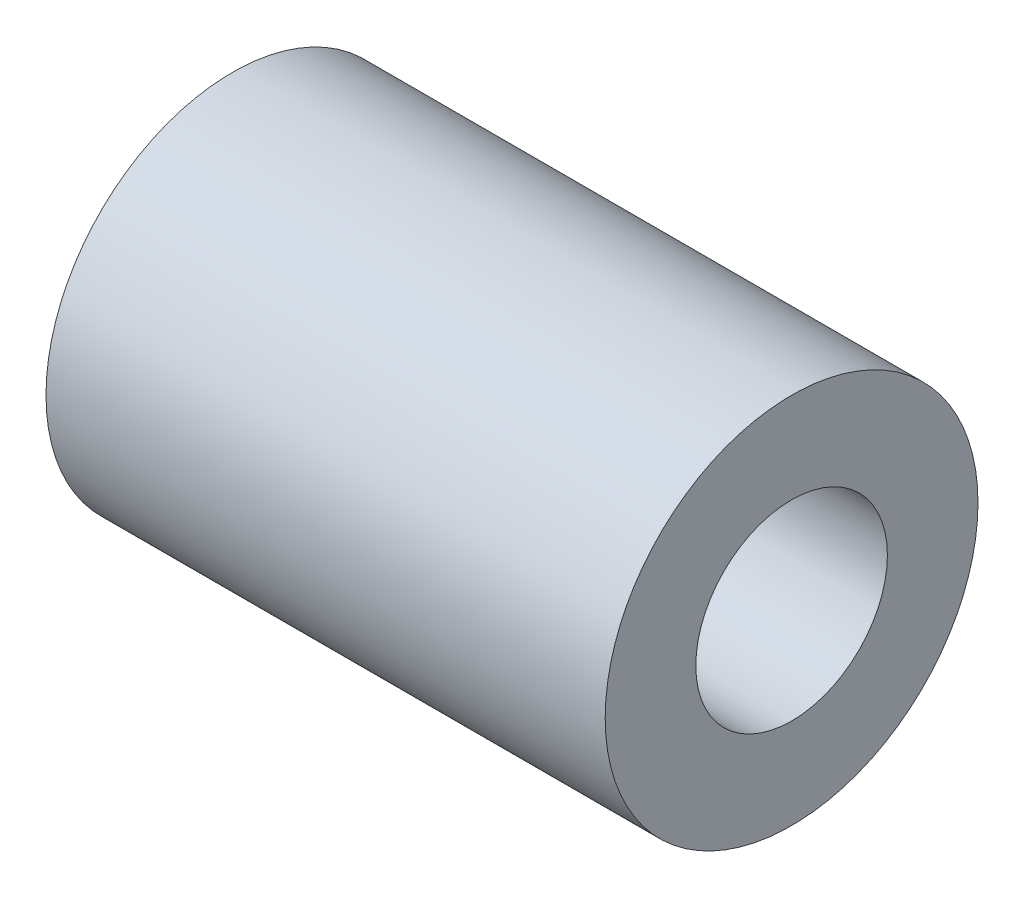
ISO-10303-21;
HEADER;
FILE_DESCRIPTION(('STEP AP214'),'2;1');
FILE_NAME('part.step','',(''),(''),'','','');
FILE_SCHEMA(('AUTOMOTIVE_DESIGN { 1 0 10303 214 1 1 1 1 }'));
ENDSEC;
DATA;
#1=APPLICATION_CONTEXT('core data for automotive mechanical design processes');
#2=APPLICATION_PROTOCOL_DEFINITION('international standard','automotive_design',2000,#1);
#3=PRODUCT_CONTEXT('',#1,'mechanical');
#4=PRODUCT('Part','Part','',(#3));
#5=PRODUCT_RELATED_PRODUCT_CATEGORY('part','',(#4));
#6=PRODUCT_DEFINITION_FORMATION('','',#4);
#7=PRODUCT_DEFINITION_CONTEXT('part definition',#1,'design');
#8=PRODUCT_DEFINITION('design','',#6,#7);
#9=PRODUCT_DEFINITION_SHAPE('','',#8);
#10=(LENGTH_UNIT() NAMED_UNIT(*) SI_UNIT(.MILLI.,.METRE.));
#11=(NAMED_UNIT(*) PLANE_ANGLE_UNIT() SI_UNIT($,.RADIAN.));
#12=(NAMED_UNIT(*) SI_UNIT($,.STERADIAN.) SOLID_ANGLE_UNIT());
#13=UNCERTAINTY_MEASURE_WITH_UNIT(LENGTH_MEASURE(1.E-05),#10,'distance_accuracy_value','');
#14=(GEOMETRIC_REPRESENTATION_CONTEXT(3) GLOBAL_UNCERTAINTY_ASSIGNED_CONTEXT((#13)) GLOBAL_UNIT_ASSIGNED_CONTEXT((#10,
#11,#12)) REPRESENTATION_CONTEXT('',''));
#15=CARTESIAN_POINT('',(0.,0.,0.));
#16=DIRECTION('',(0.,0.,1.));
#17=DIRECTION('',(1.,0.,0.));
#18=AXIS2_PLACEMENT_3D('',#15,#16,#17);
#19=CARTESIAN_POINT('',(19.05,0.,0.));
#20=DIRECTION('',(1.,0.,0.));
#21=DIRECTION('',(0.,0.,-1.));
#22=AXIS2_PLACEMENT_3D('',#19,#20,#21);
#23=PLANE('',#22);
#24=CARTESIAN_POINT('',(19.05,0.,0.));
#25=DIRECTION('',(1.,0.,0.));
#26=DIRECTION('',(0.,0.,-1.));
#27=AXIS2_PLACEMENT_3D('',#24,#25,#26);
#28=CIRCLE('',#27,6.35);
#29=CARTESIAN_POINT('',(19.05,0.,6.35));
#30=VERTEX_POINT('',#29);
#31=EDGE_CURVE('E10',#30,#30,#28,.T.);
#32=ORIENTED_EDGE('',*,*,#31,.T.);
#33=EDGE_LOOP('',(#32));
#34=FACE_BOUND('',#33,.T.);
#35=CARTESIAN_POINT('',(19.05,0.,0.));
#36=DIRECTION('',(1.,0.,0.));
#37=DIRECTION('',(0.,0.,-1.));
#38=AXIS2_PLACEMENT_3D('',#35,#36,#37);
#39=CIRCLE('',#38,3.2639);
#40=CARTESIAN_POINT('',(19.05,0.,3.2639));
#41=VERTEX_POINT('',#40);
#42=EDGE_CURVE('E44',#41,#41,#39,.T.);
#43=ORIENTED_EDGE('',*,*,#42,.F.);
#44=EDGE_LOOP('',(#43));
#45=FACE_BOUND('',#44,.T.);
#46=ADVANCED_FACE('F33',(#34,#45),#23,.T.);
#47=CARTESIAN_POINT('',(0.,0.,0.));
#48=DIRECTION('',(1.,0.,0.));
#49=DIRECTION('',(0.,0.,-1.));
#50=AXIS2_PLACEMENT_3D('',#47,#48,#49);
#51=PLANE('',#50);
#52=CARTESIAN_POINT('',(0.,0.,0.));
#53=DIRECTION('',(1.,0.,0.));
#54=DIRECTION('',(0.,0.,-1.));
#55=AXIS2_PLACEMENT_3D('',#52,#53,#54);
#56=CIRCLE('',#55,6.35);
#57=CARTESIAN_POINT('',(0.,0.,6.35));
#58=VERTEX_POINT('',#57);
#59=EDGE_CURVE('E37',#58,#58,#56,.T.);
#60=ORIENTED_EDGE('',*,*,#59,.F.);
#61=EDGE_LOOP('',(#60));
#62=FACE_BOUND('',#61,.T.);
#63=CARTESIAN_POINT('',(0.,0.,0.));
#64=DIRECTION('',(1.,0.,0.));
#65=DIRECTION('',(0.,0.,-1.));
#66=AXIS2_PLACEMENT_3D('',#63,#64,#65);
#67=CIRCLE('',#66,3.2639);
#68=CARTESIAN_POINT('',(0.,0.,3.2639));
#69=VERTEX_POINT('',#68);
#70=EDGE_CURVE('E46',#69,#69,#67,.T.);
#71=ORIENTED_EDGE('',*,*,#70,.T.);
#72=EDGE_LOOP('',(#71));
#73=FACE_BOUND('',#72,.T.);
#74=ADVANCED_FACE('F56',(#62,#73),#51,.F.);
#75=CARTESIAN_POINT('',(19.05,0.,0.));
#76=DIRECTION('',(-1.,0.,0.));
#77=DIRECTION('',(0.,0.,1.));
#78=AXIS2_PLACEMENT_3D('',#75,#76,#77);
#79=CYLINDRICAL_SURFACE('',#78,6.35);
#80=CARTESIAN_POINT('',(19.05,0.,6.35));
#81=CARTESIAN_POINT('',(18.8515625,0.,6.35));
#82=CARTESIAN_POINT('',(18.653125,0.,6.35));
#83=CARTESIAN_POINT('',(18.25625,0.,6.35));
#84=CARTESIAN_POINT('',(18.0578125,0.,6.35));
#85=CARTESIAN_POINT('',(17.6609375,0.,6.35));
#86=CARTESIAN_POINT('',(17.4625,0.,6.35));
#87=CARTESIAN_POINT('',(17.065625,0.,6.35));
#88=CARTESIAN_POINT('',(16.8671875,0.,6.35));
#89=CARTESIAN_POINT('',(16.4703125,0.,6.35));
#90=CARTESIAN_POINT('',(16.271875,0.,6.35));
#91=CARTESIAN_POINT('',(15.875,0.,6.35));
#92=CARTESIAN_POINT('',(15.6765625,0.,6.35));
#93=CARTESIAN_POINT('',(15.2796875,0.,6.35));
#94=CARTESIAN_POINT('',(15.08125,0.,6.35));
#95=CARTESIAN_POINT('',(14.684375,0.,6.35));
#96=CARTESIAN_POINT('',(14.4859375,0.,6.35));
#97=CARTESIAN_POINT('',(14.0890625,0.,6.35));
#98=CARTESIAN_POINT('',(13.890625,0.,6.35));
#99=CARTESIAN_POINT('',(13.49375,0.,6.35));
#100=CARTESIAN_POINT('',(13.2953125,0.,6.35));
#101=CARTESIAN_POINT('',(12.8984375,0.,6.35));
#102=CARTESIAN_POINT('',(12.7,0.,6.35));
#103=CARTESIAN_POINT('',(12.303125,0.,6.35));
#104=CARTESIAN_POINT('',(12.1046875,0.,6.35));
#105=CARTESIAN_POINT('',(11.7078125,0.,6.35));
#106=CARTESIAN_POINT('',(11.509375,0.,6.35));
#107=CARTESIAN_POINT('',(11.1125,0.,6.35));
#108=CARTESIAN_POINT('',(10.9140625,0.,6.35));
#109=CARTESIAN_POINT('',(10.5171875,0.,6.35));
#110=CARTESIAN_POINT('',(10.31875,0.,6.35));
#111=CARTESIAN_POINT('',(9.921875,0.,6.35));
#112=CARTESIAN_POINT('',(9.7234375,0.,6.35));
#113=CARTESIAN_POINT('',(9.3265625,0.,6.35));
#114=CARTESIAN_POINT('',(9.128125,0.,6.35));
#115=CARTESIAN_POINT('',(8.73125,0.,6.35));
#116=CARTESIAN_POINT('',(8.5328125,0.,6.35));
#117=CARTESIAN_POINT('',(8.1359375,0.,6.35));
#118=CARTESIAN_POINT('',(7.9375,0.,6.35));
#119=CARTESIAN_POINT('',(7.540625,0.,6.35));
#120=CARTESIAN_POINT('',(7.3421875,0.,6.35));
#121=CARTESIAN_POINT('',(6.9453125,0.,6.35));
#122=CARTESIAN_POINT('',(6.746875,0.,6.35));
#123=CARTESIAN_POINT('',(6.35,0.,6.35));
#124=CARTESIAN_POINT('',(6.1515625,0.,6.35));
#125=CARTESIAN_POINT('',(5.7546875,0.,6.35));
#126=CARTESIAN_POINT('',(5.55625,0.,6.35));
#127=CARTESIAN_POINT('',(5.159375,0.,6.35));
#128=CARTESIAN_POINT('',(4.9609375,0.,6.35));
#129=CARTESIAN_POINT('',(4.5640625,0.,6.35));
#130=CARTESIAN_POINT('',(4.365625,0.,6.35));
#131=CARTESIAN_POINT('',(3.96875,0.,6.35));
#132=CARTESIAN_POINT('',(3.7703125,0.,6.35));
#133=CARTESIAN_POINT('',(3.3734375,0.,6.35));
#134=CARTESIAN_POINT('',(3.175,0.,6.35));
#135=CARTESIAN_POINT('',(2.778125,0.,6.35));
#136=CARTESIAN_POINT('',(2.5796875,0.,6.35));
#137=CARTESIAN_POINT('',(2.1828125,0.,6.35));
#138=CARTESIAN_POINT('',(1.984375,0.,6.35));
#139=CARTESIAN_POINT('',(1.5875,0.,6.35));
#140=CARTESIAN_POINT('',(1.3890625,0.,6.35));
#141=CARTESIAN_POINT('',(0.992187500000001,0.,6.35));
#142=CARTESIAN_POINT('',(0.793750000000001,0.,6.35));
#143=CARTESIAN_POINT('',(0.396875,0.,6.35));
#144=CARTESIAN_POINT('',(0.1984375,0.,6.35));
#145=CARTESIAN_POINT('',(0.,0.,6.35));
#146=B_SPLINE_CURVE_WITH_KNOTS('',3,(#80,#81,#82,#83,#84,#85,#86,#87,#88,#89,#90,#91,#92,#93,
#94,#95,#96,#97,#98,#99,#100,#101,#102,#103,#104,#105,#106,#107,#108,#109,#110,#111,#112,#113,
#114,#115,#116,#117,#118,#119,#120,#121,#122,#123,#124,#125,#126,#127,#128,#129,#130,#131,#132,
#133,#134,#135,#136,#137,#138,#139,#140,#141,#142,#143,#144,#145),.UNSPECIFIED.,.F.,.F.,(4,2,2,
2,2,2,2,2,2,2,2,2,2,2,2,2,2,2,2,2,2,2,2,2,2,2,2,2,2,2,2,2,4),(0.,0.5953125,1.190625,1.7859375,
2.38125,2.9765625,3.571875,4.1671875,4.7625,5.3578125,5.953125,6.5484375,7.14375,7.7390625,
8.334375,8.9296875,9.525,10.1203125,10.715625,11.3109375,11.90625,12.5015625,13.096875,
13.6921875,14.2875,14.8828125,15.478125,16.0734375,16.66875,17.2640625,17.859375,18.4546875,
19.05),.UNSPECIFIED.);
#147=EDGE_CURVE('BSEAM35',#30,#58,#146,.T.);
#148=ORIENTED_EDGE('',*,*,#31,.F.);
#149=ORIENTED_EDGE('',*,*,#59,.T.);
#150=ORIENTED_EDGE('',*,*,#147,.T.);
#151=ORIENTED_EDGE('',*,*,#147,.F.);
#152=EDGE_LOOP('',(#148,#150,#149,#151));
#153=FACE_BOUND('',#152,.T.);
#154=ADVANCED_FACE('F35',(#153),#79,.T.);
#155=CARTESIAN_POINT('',(19.05,0.,0.));
#156=DIRECTION('',(-1.,0.,0.));
#157=DIRECTION('',(0.,0.,1.));
#158=AXIS2_PLACEMENT_3D('',#155,#156,#157);
#159=CYLINDRICAL_SURFACE('',#158,3.2639);
#160=CARTESIAN_POINT('',(19.05,0.,3.2639));
#161=CARTESIAN_POINT('',(18.8515625,0.,3.2639));
#162=CARTESIAN_POINT('',(18.653125,0.,3.2639));
#163=CARTESIAN_POINT('',(18.25625,0.,3.2639));
#164=CARTESIAN_POINT('',(18.0578125,0.,3.2639));
#165=CARTESIAN_POINT('',(17.6609375,0.,3.2639));
#166=CARTESIAN_POINT('',(17.4625,0.,3.2639));
#167=CARTESIAN_POINT('',(17.065625,0.,3.2639));
#168=CARTESIAN_POINT('',(16.8671875,0.,3.2639));
#169=CARTESIAN_POINT('',(16.4703125,0.,3.2639));
#170=CARTESIAN_POINT('',(16.271875,0.,3.2639));
#171=CARTESIAN_POINT('',(15.875,0.,3.2639));
#172=CARTESIAN_POINT('',(15.6765625,0.,3.2639));
#173=CARTESIAN_POINT('',(15.2796875,0.,3.2639));
#174=CARTESIAN_POINT('',(15.08125,0.,3.2639));
#175=CARTESIAN_POINT('',(14.684375,0.,3.2639));
#176=CARTESIAN_POINT('',(14.4859375,0.,3.2639));
#177=CARTESIAN_POINT('',(14.0890625,0.,3.2639));
#178=CARTESIAN_POINT('',(13.890625,0.,3.2639));
#179=CARTESIAN_POINT('',(13.49375,0.,3.2639));
#180=CARTESIAN_POINT('',(13.2953125,0.,3.2639));
#181=CARTESIAN_POINT('',(12.8984375,0.,3.2639));
#182=CARTESIAN_POINT('',(12.7,0.,3.2639));
#183=CARTESIAN_POINT('',(12.303125,0.,3.2639));
#184=CARTESIAN_POINT('',(12.1046875,0.,3.2639));
#185=CARTESIAN_POINT('',(11.7078125,0.,3.2639));
#186=CARTESIAN_POINT('',(11.509375,0.,3.2639));
#187=CARTESIAN_POINT('',(11.1125,0.,3.2639));
#188=CARTESIAN_POINT('',(10.9140625,0.,3.2639));
#189=CARTESIAN_POINT('',(10.5171875,0.,3.2639));
#190=CARTESIAN_POINT('',(10.31875,0.,3.2639));
#191=CARTESIAN_POINT('',(9.921875,0.,3.2639));
#192=CARTESIAN_POINT('',(9.7234375,0.,3.2639));
#193=CARTESIAN_POINT('',(9.3265625,0.,3.2639));
#194=CARTESIAN_POINT('',(9.128125,0.,3.2639));
#195=CARTESIAN_POINT('',(8.73125,0.,3.2639));
#196=CARTESIAN_POINT('',(8.5328125,0.,3.2639));
#197=CARTESIAN_POINT('',(8.1359375,0.,3.2639));
#198=CARTESIAN_POINT('',(7.9375,0.,3.2639));
#199=CARTESIAN_POINT('',(7.540625,0.,3.2639));
#200=CARTESIAN_POINT('',(7.3421875,0.,3.2639));
#201=CARTESIAN_POINT('',(6.9453125,0.,3.2639));
#202=CARTESIAN_POINT('',(6.746875,0.,3.2639));
#203=CARTESIAN_POINT('',(6.35,0.,3.2639));
#204=CARTESIAN_POINT('',(6.1515625,0.,3.2639));
#205=CARTESIAN_POINT('',(5.7546875,0.,3.2639));
#206=CARTESIAN_POINT('',(5.55625,0.,3.2639));
#207=CARTESIAN_POINT('',(5.159375,0.,3.2639));
#208=CARTESIAN_POINT('',(4.9609375,0.,3.2639));
#209=CARTESIAN_POINT('',(4.5640625,0.,3.2639));
#210=CARTESIAN_POINT('',(4.365625,0.,3.2639));
#211=CARTESIAN_POINT('',(3.96875,0.,3.2639));
#212=CARTESIAN_POINT('',(3.7703125,0.,3.2639));
#213=CARTESIAN_POINT('',(3.3734375,0.,3.2639));
#214=CARTESIAN_POINT('',(3.175,0.,3.2639));
#215=CARTESIAN_POINT('',(2.778125,0.,3.2639));
#216=CARTESIAN_POINT('',(2.5796875,0.,3.2639));
#217=CARTESIAN_POINT('',(2.1828125,0.,3.2639));
#218=CARTESIAN_POINT('',(1.984375,0.,3.2639));
#219=CARTESIAN_POINT('',(1.5875,0.,3.2639));
#220=CARTESIAN_POINT('',(1.3890625,0.,3.2639));
#221=CARTESIAN_POINT('',(0.992187500000001,0.,3.2639));
#222=CARTESIAN_POINT('',(0.793750000000001,0.,3.2639));
#223=CARTESIAN_POINT('',(0.396875,0.,3.2639));
#224=CARTESIAN_POINT('',(0.1984375,0.,3.2639));
#225=CARTESIAN_POINT('',(0.,0.,3.2639));
#226=B_SPLINE_CURVE_WITH_KNOTS('',3,(#160,#161,#162,#163,#164,#165,#166,#167,#168,#169,#170,
#171,#172,#173,#174,#175,#176,#177,#178,#179,#180,#181,#182,#183,#184,#185,#186,#187,#188,#189,
#190,#191,#192,#193,#194,#195,#196,#197,#198,#199,#200,#201,#202,#203,#204,#205,#206,#207,#208,
#209,#210,#211,#212,#213,#214,#215,#216,#217,#218,#219,#220,#221,#222,#223,#224,#225),
.UNSPECIFIED.,.F.,.F.,(4,2,2,2,2,2,2,2,2,2,2,2,2,2,2,2,2,2,2,2,2,2,2,2,2,2,2,2,2,2,2,2,4),(0.,
0.595312499999997,1.190625,1.7859375,2.38125,2.9765625,3.571875,4.1671875,4.7625,5.3578125,
5.953125,6.5484375,7.14375,7.7390625,8.334375,8.9296875,9.525,10.1203125,10.715625,11.3109375,
11.90625,12.5015625,13.096875,13.6921875,14.2875,14.8828125,15.478125,16.0734375,16.66875,
17.2640625,17.859375,18.4546875,19.05),.UNSPECIFIED.);
#227=EDGE_CURVE('BSEAM52',#41,#69,#226,.T.);
#228=ORIENTED_EDGE('',*,*,#42,.T.);
#229=ORIENTED_EDGE('',*,*,#70,.F.);
#230=ORIENTED_EDGE('',*,*,#227,.T.);
#231=ORIENTED_EDGE('',*,*,#227,.F.);
#232=EDGE_LOOP('',(#228,#230,#229,#231));
#233=FACE_BOUND('',#232,.T.);
#234=ADVANCED_FACE('F52',(#233),#159,.F.);
#235=CLOSED_SHELL('',(#46,#74,#154,#234));
#236=MANIFOLD_SOLID_BREP('B2',#235);
#237=ADVANCED_BREP_SHAPE_REPRESENTATION('',(#18,#236),#14);
#238=SHAPE_DEFINITION_REPRESENTATION(#9,#237);
ENDSEC;
END-ISO-10303-21;
